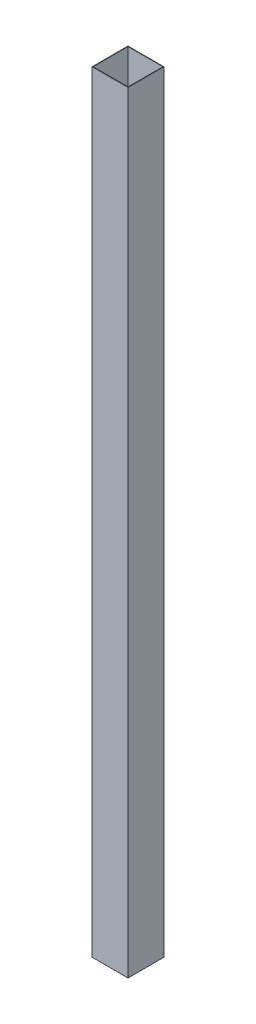
ISO-10303-21;
HEADER;
FILE_DESCRIPTION(('STEP AP214'),'2;1');
FILE_NAME('part.step','',(''),(''),'','','');
FILE_SCHEMA(('AUTOMOTIVE_DESIGN { 1 0 10303 214 1 1 1 1 }'));
ENDSEC;
DATA;
#1=APPLICATION_CONTEXT('core data for automotive mechanical design processes');
#2=APPLICATION_PROTOCOL_DEFINITION('international standard','automotive_design',2000,#1);
#3=PRODUCT_CONTEXT('',#1,'mechanical');
#4=PRODUCT('Part','Part','',(#3));
#5=PRODUCT_RELATED_PRODUCT_CATEGORY('part','',(#4));
#6=PRODUCT_DEFINITION_FORMATION('','',#4);
#7=PRODUCT_DEFINITION_CONTEXT('part definition',#1,'design');
#8=PRODUCT_DEFINITION('design','',#6,#7);
#9=PRODUCT_DEFINITION_SHAPE('','',#8);
#10=(LENGTH_UNIT() NAMED_UNIT(*) SI_UNIT(.MILLI.,.METRE.));
#11=(NAMED_UNIT(*) PLANE_ANGLE_UNIT() SI_UNIT($,.RADIAN.));
#12=(NAMED_UNIT(*) SI_UNIT($,.STERADIAN.) SOLID_ANGLE_UNIT());
#13=UNCERTAINTY_MEASURE_WITH_UNIT(LENGTH_MEASURE(1.E-05),#10,'distance_accuracy_value','');
#14=(GEOMETRIC_REPRESENTATION_CONTEXT(3) GLOBAL_UNCERTAINTY_ASSIGNED_CONTEXT((#13)) GLOBAL_UNIT_ASSIGNED_CONTEXT((#10,
#11,#12)) REPRESENTATION_CONTEXT('',''));
#15=CARTESIAN_POINT('',(0.,0.,0.));
#16=DIRECTION('',(0.,0.,1.));
#17=DIRECTION('',(1.,0.,0.));
#18=AXIS2_PLACEMENT_3D('',#15,#16,#17);
#19=CARTESIAN_POINT('',(20.,860.,20.));
#20=DIRECTION('',(-1.,0.,0.));
#21=DIRECTION('',(0.,0.,1.));
#22=AXIS2_PLACEMENT_3D('',#19,#20,#21);
#23=PLANE('',#22);
#24=DIRECTION('',(0.,0.,-1.));
#25=VECTOR('',#24,1.);
#26=CARTESIAN_POINT('',(20.,0.,20.));
#27=LINE('',#26,#25);
#28=CARTESIAN_POINT('',(20.,0.,20.));
#29=VERTEX_POINT('',#28);
#30=CARTESIAN_POINT('',(20.,0.,-20.));
#31=VERTEX_POINT('',#30);
#32=EDGE_CURVE('E129',#29,#31,#27,.T.);
#33=ORIENTED_EDGE('',*,*,#32,.T.);
#34=DIRECTION('',(0.,-1.,0.));
#35=VECTOR('',#34,1.);
#36=CARTESIAN_POINT('',(20.,860.,-20.));
#37=LINE('',#36,#35);
#38=CARTESIAN_POINT('',(20.,860.,-20.));
#39=VERTEX_POINT('',#38);
#40=EDGE_CURVE('E11',#39,#31,#37,.T.);
#41=ORIENTED_EDGE('',*,*,#40,.F.);
#42=DIRECTION('',(0.,0.,-1.));
#43=VECTOR('',#42,1.);
#44=CARTESIAN_POINT('',(20.,860.,20.));
#45=LINE('',#44,#43);
#46=CARTESIAN_POINT('',(20.,860.,20.));
#47=VERTEX_POINT('',#46);
#48=EDGE_CURVE('E133',#47,#39,#45,.T.);
#49=ORIENTED_EDGE('',*,*,#48,.F.);
#50=DIRECTION('',(0.,-1.,0.));
#51=VECTOR('',#50,1.);
#52=CARTESIAN_POINT('',(20.,860.,20.));
#53=LINE('',#52,#51);
#54=EDGE_CURVE('E143',#47,#29,#53,.T.);
#55=ORIENTED_EDGE('',*,*,#54,.T.);
#56=EDGE_LOOP('',(#33,#41,#49,#55));
#57=FACE_BOUND('',#56,.T.);
#58=ADVANCED_FACE('F32',(#57),#23,.F.);
#59=CARTESIAN_POINT('',(-20.,860.,-20.));
#60=DIRECTION('',(0.,0.,1.));
#61=DIRECTION('',(1.,0.,0.));
#62=AXIS2_PLACEMENT_3D('',#59,#60,#61);
#63=PLANE('',#62);
#64=DIRECTION('',(-1.,0.,0.));
#65=VECTOR('',#64,1.);
#66=CARTESIAN_POINT('',(-20.,0.,-20.));
#67=LINE('',#66,#65);
#68=CARTESIAN_POINT('',(-20.,0.,-20.));
#69=VERTEX_POINT('',#68);
#70=EDGE_CURVE('E146',#31,#69,#67,.T.);
#71=ORIENTED_EDGE('',*,*,#70,.T.);
#72=DIRECTION('',(0.,-1.,0.));
#73=VECTOR('',#72,1.);
#74=CARTESIAN_POINT('',(-20.,860.,-20.));
#75=LINE('',#74,#73);
#76=CARTESIAN_POINT('',(-20.,860.,-20.));
#77=VERTEX_POINT('',#76);
#78=EDGE_CURVE('E39',#77,#69,#75,.T.);
#79=ORIENTED_EDGE('',*,*,#78,.F.);
#80=DIRECTION('',(-1.,0.,0.));
#81=VECTOR('',#80,1.);
#82=CARTESIAN_POINT('',(-20.,860.,-20.));
#83=LINE('',#82,#81);
#84=EDGE_CURVE('E136',#39,#77,#83,.T.);
#85=ORIENTED_EDGE('',*,*,#84,.F.);
#86=ORIENTED_EDGE('',*,*,#40,.T.);
#87=EDGE_LOOP('',(#71,#79,#85,#86));
#88=FACE_BOUND('',#87,.T.);
#89=ADVANCED_FACE('F174',(#88),#63,.F.);
#90=CARTESIAN_POINT('',(-20.,860.,20.));
#91=DIRECTION('',(1.,0.,0.));
#92=DIRECTION('',(0.,0.,-1.));
#93=AXIS2_PLACEMENT_3D('',#90,#91,#92);
#94=PLANE('',#93);
#95=DIRECTION('',(0.,0.,1.));
#96=VECTOR('',#95,1.);
#97=CARTESIAN_POINT('',(-20.,0.,20.));
#98=LINE('',#97,#96);
#99=CARTESIAN_POINT('',(-20.,0.,20.));
#100=VERTEX_POINT('',#99);
#101=EDGE_CURVE('E148',#69,#100,#98,.T.);
#102=ORIENTED_EDGE('',*,*,#101,.T.);
#103=DIRECTION('',(0.,-1.,0.));
#104=VECTOR('',#103,1.);
#105=CARTESIAN_POINT('',(-20.,860.,20.));
#106=LINE('',#105,#104);
#107=CARTESIAN_POINT('',(-20.,860.,20.));
#108=VERTEX_POINT('',#107);
#109=EDGE_CURVE('E153',#108,#100,#106,.T.);
#110=ORIENTED_EDGE('',*,*,#109,.F.);
#111=DIRECTION('',(0.,0.,1.));
#112=VECTOR('',#111,1.);
#113=CARTESIAN_POINT('',(-20.,860.,20.));
#114=LINE('',#113,#112);
#115=EDGE_CURVE('E139',#77,#108,#114,.T.);
#116=ORIENTED_EDGE('',*,*,#115,.F.);
#117=ORIENTED_EDGE('',*,*,#78,.T.);
#118=EDGE_LOOP('',(#102,#110,#116,#117));
#119=FACE_BOUND('',#118,.T.);
#120=ADVANCED_FACE('F160',(#119),#94,.F.);
#121=CARTESIAN_POINT('',(-20.,860.,20.));
#122=DIRECTION('',(0.,0.,-1.));
#123=DIRECTION('',(-1.,0.,0.));
#124=AXIS2_PLACEMENT_3D('',#121,#122,#123);
#125=PLANE('',#124);
#126=DIRECTION('',(1.,0.,0.));
#127=VECTOR('',#126,1.);
#128=CARTESIAN_POINT('',(-20.,0.,20.));
#129=LINE('',#128,#127);
#130=EDGE_CURVE('E137',#100,#29,#129,.T.);
#131=ORIENTED_EDGE('',*,*,#130,.T.);
#132=ORIENTED_EDGE('',*,*,#54,.F.);
#133=DIRECTION('',(1.,0.,0.));
#134=VECTOR('',#133,1.);
#135=CARTESIAN_POINT('',(-20.,860.,20.));
#136=LINE('',#135,#134);
#137=EDGE_CURVE('E141',#108,#47,#136,.T.);
#138=ORIENTED_EDGE('',*,*,#137,.F.);
#139=ORIENTED_EDGE('',*,*,#109,.T.);
#140=EDGE_LOOP('',(#131,#132,#138,#139));
#141=FACE_BOUND('',#140,.T.);
#142=ADVANCED_FACE('F169',(#141),#125,.F.);
#143=CARTESIAN_POINT('',(0.,860.,0.));
#144=DIRECTION('',(0.,-1.,0.));
#145=DIRECTION('',(0.,0.,-1.));
#146=AXIS2_PLACEMENT_3D('',#143,#144,#145);
#147=PLANE('',#146);
#148=DIRECTION('',(1.,0.,0.));
#149=VECTOR('',#148,1.);
#150=CARTESIAN_POINT('',(-19.5,860.,-19.5));
#151=LINE('',#150,#149);
#152=CARTESIAN_POINT('',(-19.5,860.,-19.5));
#153=VERTEX_POINT('',#152);
#154=CARTESIAN_POINT('',(19.5,860.,-19.5));
#155=VERTEX_POINT('',#154);
#156=EDGE_CURVE('E104',#153,#155,#151,.T.);
#157=ORIENTED_EDGE('',*,*,#156,.T.);
#158=DIRECTION('',(0.,0.,1.));
#159=VECTOR('',#158,1.);
#160=CARTESIAN_POINT('',(19.5,860.,-19.5));
#161=LINE('',#160,#159);
#162=CARTESIAN_POINT('',(19.5,860.,19.5));
#163=VERTEX_POINT('',#162);
#164=EDGE_CURVE('E98',#155,#163,#161,.T.);
#165=ORIENTED_EDGE('',*,*,#164,.T.);
#166=DIRECTION('',(-1.,0.,0.));
#167=VECTOR('',#166,1.);
#168=CARTESIAN_POINT('',(-19.5,860.,19.5));
#169=LINE('',#168,#167);
#170=CARTESIAN_POINT('',(-19.5,860.,19.5));
#171=VERTEX_POINT('',#170);
#172=EDGE_CURVE('E107',#163,#171,#169,.T.);
#173=ORIENTED_EDGE('',*,*,#172,.T.);
#174=DIRECTION('',(0.,0.,-1.));
#175=VECTOR('',#174,1.);
#176=CARTESIAN_POINT('',(-19.5,860.,-19.5));
#177=LINE('',#176,#175);
#178=EDGE_CURVE('E46',#171,#153,#177,.T.);
#179=ORIENTED_EDGE('',*,*,#178,.T.);
#180=EDGE_LOOP('',(#157,#165,#173,#179));
#181=FACE_BOUND('',#180,.T.);
#182=ORIENTED_EDGE('',*,*,#48,.T.);
#183=ORIENTED_EDGE('',*,*,#84,.T.);
#184=ORIENTED_EDGE('',*,*,#115,.T.);
#185=ORIENTED_EDGE('',*,*,#137,.T.);
#186=EDGE_LOOP('',(#182,#183,#184,#185));
#187=FACE_BOUND('',#186,.T.);
#188=ADVANCED_FACE('F111',(#181,#187),#147,.F.);
#189=CARTESIAN_POINT('',(0.,0.,0.));
#190=DIRECTION('',(0.,-1.,0.));
#191=DIRECTION('',(0.,0.,-1.));
#192=AXIS2_PLACEMENT_3D('',#189,#190,#191);
#193=PLANE('',#192);
#194=DIRECTION('',(0.,0.,1.));
#195=VECTOR('',#194,1.);
#196=CARTESIAN_POINT('',(19.5,0.,-19.5));
#197=LINE('',#196,#195);
#198=CARTESIAN_POINT('',(19.5,0.,-19.5));
#199=VERTEX_POINT('',#198);
#200=CARTESIAN_POINT('',(19.5,0.,19.5));
#201=VERTEX_POINT('',#200);
#202=EDGE_CURVE('E54',#199,#201,#197,.T.);
#203=ORIENTED_EDGE('',*,*,#202,.F.);
#204=DIRECTION('',(1.,0.,0.));
#205=VECTOR('',#204,1.);
#206=CARTESIAN_POINT('',(-19.5,0.,-19.5));
#207=LINE('',#206,#205);
#208=CARTESIAN_POINT('',(-19.5,0.,-19.5));
#209=VERTEX_POINT('',#208);
#210=EDGE_CURVE('E114',#209,#199,#207,.T.);
#211=ORIENTED_EDGE('',*,*,#210,.F.);
#212=DIRECTION('',(0.,0.,-1.));
#213=VECTOR('',#212,1.);
#214=CARTESIAN_POINT('',(-19.5,0.,-19.5));
#215=LINE('',#214,#213);
#216=CARTESIAN_POINT('',(-19.5,0.,19.5));
#217=VERTEX_POINT('',#216);
#218=EDGE_CURVE('E117',#217,#209,#215,.T.);
#219=ORIENTED_EDGE('',*,*,#218,.F.);
#220=DIRECTION('',(-1.,0.,0.));
#221=VECTOR('',#220,1.);
#222=CARTESIAN_POINT('',(-19.5,0.,19.5));
#223=LINE('',#222,#221);
#224=EDGE_CURVE('E123',#201,#217,#223,.T.);
#225=ORIENTED_EDGE('',*,*,#224,.F.);
#226=EDGE_LOOP('',(#203,#211,#219,#225));
#227=FACE_BOUND('',#226,.T.);
#228=ORIENTED_EDGE('',*,*,#32,.F.);
#229=ORIENTED_EDGE('',*,*,#130,.F.);
#230=ORIENTED_EDGE('',*,*,#101,.F.);
#231=ORIENTED_EDGE('',*,*,#70,.F.);
#232=EDGE_LOOP('',(#228,#229,#230,#231));
#233=FACE_BOUND('',#232,.T.);
#234=ADVANCED_FACE('F166',(#227,#233),#193,.T.);
#235=CARTESIAN_POINT('',(19.5,860.,-19.5));
#236=DIRECTION('',(1.,0.,0.));
#237=DIRECTION('',(0.,0.,-1.));
#238=AXIS2_PLACEMENT_3D('',#235,#236,#237);
#239=PLANE('',#238);
#240=ORIENTED_EDGE('',*,*,#202,.T.);
#241=DIRECTION('',(0.,-1.,0.));
#242=VECTOR('',#241,1.);
#243=CARTESIAN_POINT('',(19.5,860.,19.5));
#244=LINE('',#243,#242);
#245=EDGE_CURVE('E94',#163,#201,#244,.T.);
#246=ORIENTED_EDGE('',*,*,#245,.F.);
#247=ORIENTED_EDGE('',*,*,#164,.F.);
#248=DIRECTION('',(0.,-1.,0.));
#249=VECTOR('',#248,1.);
#250=CARTESIAN_POINT('',(19.5,860.,-19.5));
#251=LINE('',#250,#249);
#252=EDGE_CURVE('E127',#155,#199,#251,.T.);
#253=ORIENTED_EDGE('',*,*,#252,.T.);
#254=EDGE_LOOP('',(#240,#246,#247,#253));
#255=FACE_BOUND('',#254,.T.);
#256=ADVANCED_FACE('F96',(#255),#239,.F.);
#257=CARTESIAN_POINT('',(-19.5,860.,-19.5));
#258=DIRECTION('',(0.,0.,-1.));
#259=DIRECTION('',(-1.,0.,0.));
#260=AXIS2_PLACEMENT_3D('',#257,#258,#259);
#261=PLANE('',#260);
#262=ORIENTED_EDGE('',*,*,#210,.T.);
#263=ORIENTED_EDGE('',*,*,#252,.F.);
#264=ORIENTED_EDGE('',*,*,#156,.F.);
#265=DIRECTION('',(0.,-1.,0.));
#266=VECTOR('',#265,1.);
#267=CARTESIAN_POINT('',(-19.5,860.,-19.5));
#268=LINE('',#267,#266);
#269=EDGE_CURVE('E130',#153,#209,#268,.T.);
#270=ORIENTED_EDGE('',*,*,#269,.T.);
#271=EDGE_LOOP('',(#262,#263,#264,#270));
#272=FACE_BOUND('',#271,.T.);
#273=ADVANCED_FACE('F191',(#272),#261,.F.);
#274=CARTESIAN_POINT('',(-19.5,860.,-19.5));
#275=DIRECTION('',(-1.,0.,0.));
#276=DIRECTION('',(0.,0.,1.));
#277=AXIS2_PLACEMENT_3D('',#274,#275,#276);
#278=PLANE('',#277);
#279=ORIENTED_EDGE('',*,*,#218,.T.);
#280=ORIENTED_EDGE('',*,*,#269,.F.);
#281=ORIENTED_EDGE('',*,*,#178,.F.);
#282=DIRECTION('',(0.,-1.,0.));
#283=VECTOR('',#282,1.);
#284=CARTESIAN_POINT('',(-19.5,860.,19.5));
#285=LINE('',#284,#283);
#286=EDGE_CURVE('E103',#171,#217,#285,.T.);
#287=ORIENTED_EDGE('',*,*,#286,.T.);
#288=EDGE_LOOP('',(#279,#280,#281,#287));
#289=FACE_BOUND('',#288,.T.);
#290=ADVANCED_FACE('F194',(#289),#278,.F.);
#291=CARTESIAN_POINT('',(-19.5,860.,19.5));
#292=DIRECTION('',(0.,0.,1.));
#293=DIRECTION('',(1.,0.,0.));
#294=AXIS2_PLACEMENT_3D('',#291,#292,#293);
#295=PLANE('',#294);
#296=ORIENTED_EDGE('',*,*,#224,.T.);
#297=ORIENTED_EDGE('',*,*,#286,.F.);
#298=ORIENTED_EDGE('',*,*,#172,.F.);
#299=ORIENTED_EDGE('',*,*,#245,.T.);
#300=EDGE_LOOP('',(#296,#297,#298,#299));
#301=FACE_BOUND('',#300,.T.);
#302=ADVANCED_FACE('F108',(#301),#295,.F.);
#303=CLOSED_SHELL('',(#58,#89,#120,#142,#188,#234,#256,#273,#290,#302));
#304=MANIFOLD_SOLID_BREP('B2',#303);
#305=ADVANCED_BREP_SHAPE_REPRESENTATION('',(#18,#304),#14);
#306=SHAPE_DEFINITION_REPRESENTATION(#9,#305);
ENDSEC;
END-ISO-10303-21;
